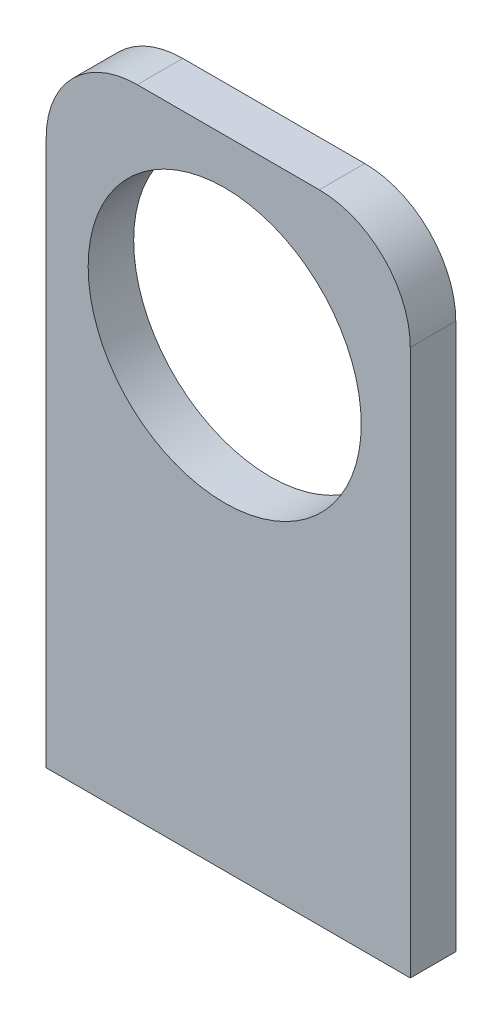
ISO-10303-21;
HEADER;
FILE_DESCRIPTION(('STEP AP214'),'2;1');
FILE_NAME('part.step','',(''),(''),'','','');
FILE_SCHEMA(('AUTOMOTIVE_DESIGN { 1 0 10303 214 1 1 1 1 }'));
ENDSEC;
DATA;
#1=APPLICATION_CONTEXT('core data for automotive mechanical design processes');
#2=APPLICATION_PROTOCOL_DEFINITION('international standard','automotive_design',2000,#1);
#3=PRODUCT_CONTEXT('',#1,'mechanical');
#4=PRODUCT('Part','Part','',(#3));
#5=PRODUCT_RELATED_PRODUCT_CATEGORY('part','',(#4));
#6=PRODUCT_DEFINITION_FORMATION('','',#4);
#7=PRODUCT_DEFINITION_CONTEXT('part definition',#1,'design');
#8=PRODUCT_DEFINITION('design','',#6,#7);
#9=PRODUCT_DEFINITION_SHAPE('','',#8);
#10=(LENGTH_UNIT() NAMED_UNIT(*) SI_UNIT(.MILLI.,.METRE.));
#11=(NAMED_UNIT(*) PLANE_ANGLE_UNIT() SI_UNIT($,.RADIAN.));
#12=(NAMED_UNIT(*) SI_UNIT($,.STERADIAN.) SOLID_ANGLE_UNIT());
#13=UNCERTAINTY_MEASURE_WITH_UNIT(LENGTH_MEASURE(1.E-05),#10,'distance_accuracy_value','');
#14=(GEOMETRIC_REPRESENTATION_CONTEXT(3) GLOBAL_UNCERTAINTY_ASSIGNED_CONTEXT((#13)) GLOBAL_UNIT_ASSIGNED_CONTEXT((#10,
#11,#12)) REPRESENTATION_CONTEXT('',''));
#15=CARTESIAN_POINT('',(0.,0.,0.));
#16=DIRECTION('',(0.,0.,1.));
#17=DIRECTION('',(1.,0.,0.));
#18=AXIS2_PLACEMENT_3D('',#15,#16,#17);
#19=CARTESIAN_POINT('',(0.,0.,3.175));
#20=DIRECTION('',(0.,0.,-1.));
#21=DIRECTION('',(-1.,0.,0.));
#22=AXIS2_PLACEMENT_3D('',#19,#20,#21);
#23=PLANE('',#22);
#24=DIRECTION('',(-1.,0.,0.));
#25=VECTOR('',#24,1.);
#26=CARTESIAN_POINT('',(-0.417525773195876,1.06958762886598,3.175));
#27=LINE('',#26,#25);
#28=CARTESIAN_POINT('',(18.6324742268041,1.06958762886598,3.175));
#29=VERTEX_POINT('',#28);
#30=CARTESIAN_POINT('',(5.93247422680412,1.06958762886598,3.175));
#31=VERTEX_POINT('',#30);
#32=EDGE_CURVE('E114',#29,#31,#27,.T.);
#33=ORIENTED_EDGE('',*,*,#32,.T.);
#34=CARTESIAN_POINT('',(5.93247422680412,-5.28041237113402,3.175));
#35=DIRECTION('',(0.,0.,-1.));
#36=DIRECTION('',(-1.,0.,0.));
#37=AXIS2_PLACEMENT_3D('',#34,#35,#36);
#38=CIRCLE('',#37,6.35);
#39=CARTESIAN_POINT('',(-0.417525773195876,-5.28041237113402,3.175));
#40=VERTEX_POINT('',#39);
#41=EDGE_CURVE('E40',#31,#40,#38,.F.);
#42=ORIENTED_EDGE('',*,*,#41,.T.);
#43=DIRECTION('',(0.,-1.,0.));
#44=VECTOR('',#43,1.);
#45=CARTESIAN_POINT('',(-0.417525773195877,-43.380412371134,3.175));
#46=LINE('',#45,#44);
#47=CARTESIAN_POINT('',(-0.417525773195877,-43.380412371134,3.175));
#48=VERTEX_POINT('',#47);
#49=EDGE_CURVE('E86',#40,#48,#46,.T.);
#50=ORIENTED_EDGE('',*,*,#49,.T.);
#51=DIRECTION('',(1.,0.,0.));
#52=VECTOR('',#51,1.);
#53=CARTESIAN_POINT('',(-0.417525773195877,-43.380412371134,3.175));
#54=LINE('',#53,#52);
#55=CARTESIAN_POINT('',(24.9824742268041,-43.380412371134,3.175));
#56=VERTEX_POINT('',#55);
#57=EDGE_CURVE('E89',#48,#56,#54,.T.);
#58=ORIENTED_EDGE('',*,*,#57,.T.);
#59=DIRECTION('',(0.,1.,0.));
#60=VECTOR('',#59,1.);
#61=CARTESIAN_POINT('',(24.9824742268041,-43.380412371134,3.175));
#62=LINE('',#61,#60);
#63=CARTESIAN_POINT('',(24.9824742268041,-5.28041237113402,3.175));
#64=VERTEX_POINT('',#63);
#65=EDGE_CURVE('E104',#56,#64,#62,.T.);
#66=ORIENTED_EDGE('',*,*,#65,.T.);
#67=CARTESIAN_POINT('',(18.6324742268041,-5.28041237113402,3.175));
#68=DIRECTION('',(0.,0.,-1.));
#69=DIRECTION('',(-1.,0.,0.));
#70=AXIS2_PLACEMENT_3D('',#67,#68,#69);
#71=CIRCLE('',#70,6.35);
#72=EDGE_CURVE('E125',#64,#29,#71,.F.);
#73=ORIENTED_EDGE('',*,*,#72,.T.);
#74=EDGE_LOOP('',(#33,#42,#50,#58,#66,#73));
#75=FACE_BOUND('',#74,.T.);
#76=CARTESIAN_POINT('',(12.0350162678135,-11.630412371134,3.175));
#77=DIRECTION('',(0.,0.,1.));
#78=DIRECTION('',(1.,0.,0.));
#79=AXIS2_PLACEMENT_3D('',#76,#77,#78);
#80=CIRCLE('',#79,9.525);
#81=CARTESIAN_POINT('',(21.5600162678135,-11.630412371134,3.175));
#82=VERTEX_POINT('',#81);
#83=EDGE_CURVE('E142',#82,#82,#80,.T.);
#84=ORIENTED_EDGE('',*,*,#83,.F.);
#85=EDGE_LOOP('',(#84));
#86=FACE_BOUND('',#85,.T.);
#87=ADVANCED_FACE('F32',(#75,#86),#23,.F.);
#88=CARTESIAN_POINT('',(0.,0.,0.));
#89=DIRECTION('',(0.,0.,-1.));
#90=DIRECTION('',(-1.,0.,0.));
#91=AXIS2_PLACEMENT_3D('',#88,#89,#90);
#92=PLANE('',#91);
#93=DIRECTION('',(0.,-1.,0.));
#94=VECTOR('',#93,1.);
#95=CARTESIAN_POINT('',(-0.417525773195877,-43.380412371134,0.));
#96=LINE('',#95,#94);
#97=CARTESIAN_POINT('',(-0.417525773195876,-5.28041237113402,0.));
#98=VERTEX_POINT('',#97);
#99=CARTESIAN_POINT('',(-0.417525773195877,-43.380412371134,0.));
#100=VERTEX_POINT('',#99);
#101=EDGE_CURVE('E108',#98,#100,#96,.T.);
#102=ORIENTED_EDGE('',*,*,#101,.F.);
#103=CARTESIAN_POINT('',(5.93247422680412,-5.28041237113402,0.));
#104=DIRECTION('',(0.,0.,-1.));
#105=DIRECTION('',(-1.,0.,0.));
#106=AXIS2_PLACEMENT_3D('',#103,#104,#105);
#107=CIRCLE('',#106,6.35);
#108=CARTESIAN_POINT('',(5.93247422680412,1.06958762886598,0.));
#109=VERTEX_POINT('',#108);
#110=EDGE_CURVE('E119',#98,#109,#107,.T.);
#111=ORIENTED_EDGE('',*,*,#110,.T.);
#112=DIRECTION('',(-1.,0.,0.));
#113=VECTOR('',#112,1.);
#114=CARTESIAN_POINT('',(-0.417525773195876,1.06958762886598,0.));
#115=LINE('',#114,#113);
#116=CARTESIAN_POINT('',(18.6324742268041,1.06958762886598,0.));
#117=VERTEX_POINT('',#116);
#118=EDGE_CURVE('E96',#117,#109,#115,.T.);
#119=ORIENTED_EDGE('',*,*,#118,.F.);
#120=CARTESIAN_POINT('',(18.6324742268041,-5.28041237113402,0.));
#121=DIRECTION('',(0.,0.,-1.));
#122=DIRECTION('',(-1.,0.,0.));
#123=AXIS2_PLACEMENT_3D('',#120,#121,#122);
#124=CIRCLE('',#123,6.35);
#125=CARTESIAN_POINT('',(24.9824742268041,-5.28041237113402,0.));
#126=VERTEX_POINT('',#125);
#127=EDGE_CURVE('E112',#117,#126,#124,.T.);
#128=ORIENTED_EDGE('',*,*,#127,.T.);
#129=DIRECTION('',(0.,1.,0.));
#130=VECTOR('',#129,1.);
#131=CARTESIAN_POINT('',(24.9824742268041,-43.380412371134,0.));
#132=LINE('',#131,#130);
#133=CARTESIAN_POINT('',(24.9824742268041,-43.380412371134,0.));
#134=VERTEX_POINT('',#133);
#135=EDGE_CURVE('E136',#134,#126,#132,.T.);
#136=ORIENTED_EDGE('',*,*,#135,.F.);
#137=DIRECTION('',(1.,0.,0.));
#138=VECTOR('',#137,1.);
#139=CARTESIAN_POINT('',(-0.417525773195877,-43.380412371134,0.));
#140=LINE('',#139,#138);
#141=EDGE_CURVE('E138',#100,#134,#140,.T.);
#142=ORIENTED_EDGE('',*,*,#141,.F.);
#143=EDGE_LOOP('',(#102,#111,#119,#128,#136,#142));
#144=FACE_BOUND('',#143,.T.);
#145=CARTESIAN_POINT('',(12.0350162678135,-11.630412371134,0.));
#146=DIRECTION('',(0.,0.,1.));
#147=DIRECTION('',(1.,0.,0.));
#148=AXIS2_PLACEMENT_3D('',#145,#146,#147);
#149=CIRCLE('',#148,9.525);
#150=CARTESIAN_POINT('',(21.5600162678135,-11.630412371134,0.));
#151=VERTEX_POINT('',#150);
#152=EDGE_CURVE('E145',#151,#151,#149,.T.);
#153=ORIENTED_EDGE('',*,*,#152,.T.);
#154=EDGE_LOOP('',(#153));
#155=FACE_BOUND('',#154,.T.);
#156=ADVANCED_FACE('F134',(#144,#155),#92,.T.);
#157=CARTESIAN_POINT('',(-0.417525773195877,-43.380412371134,3.175));
#158=DIRECTION('',(1.,0.,0.));
#159=DIRECTION('',(0.,1.,0.));
#160=AXIS2_PLACEMENT_3D('',#157,#158,#159);
#161=PLANE('',#160);
#162=ORIENTED_EDGE('',*,*,#49,.F.);
#163=DIRECTION('',(0.,0.,-1.));
#164=VECTOR('',#163,1.);
#165=CARTESIAN_POINT('',(-0.417525773195876,-5.28041237113402,3.175));
#166=LINE('',#165,#164);
#167=EDGE_CURVE('E110',#40,#98,#166,.T.);
#168=ORIENTED_EDGE('',*,*,#167,.T.);
#169=ORIENTED_EDGE('',*,*,#101,.T.);
#170=DIRECTION('',(0.,0.,-1.));
#171=VECTOR('',#170,1.);
#172=CARTESIAN_POINT('',(-0.417525773195877,-43.380412371134,3.175));
#173=LINE('',#172,#171);
#174=EDGE_CURVE('E101',#48,#100,#173,.T.);
#175=ORIENTED_EDGE('',*,*,#174,.F.);
#176=EDGE_LOOP('',(#162,#168,#169,#175));
#177=FACE_BOUND('',#176,.T.);
#178=ADVANCED_FACE('F106',(#177),#161,.F.);
#179=CARTESIAN_POINT('',(-0.417525773195877,-43.380412371134,3.175));
#180=DIRECTION('',(0.,1.,0.));
#181=DIRECTION('',(0.,0.,1.));
#182=AXIS2_PLACEMENT_3D('',#179,#180,#181);
#183=PLANE('',#182);
#184=ORIENTED_EDGE('',*,*,#141,.T.);
#185=DIRECTION('',(0.,0.,-1.));
#186=VECTOR('',#185,1.);
#187=CARTESIAN_POINT('',(24.9824742268041,-43.380412371134,3.175));
#188=LINE('',#187,#186);
#189=EDGE_CURVE('E103',#56,#134,#188,.T.);
#190=ORIENTED_EDGE('',*,*,#189,.F.);
#191=ORIENTED_EDGE('',*,*,#57,.F.);
#192=ORIENTED_EDGE('',*,*,#174,.T.);
#193=EDGE_LOOP('',(#184,#190,#191,#192));
#194=FACE_BOUND('',#193,.T.);
#195=ADVANCED_FACE('F100',(#194),#183,.F.);
#196=CARTESIAN_POINT('',(24.9824742268041,-43.380412371134,3.175));
#197=DIRECTION('',(-1.,0.,0.));
#198=DIRECTION('',(0.,0.,1.));
#199=AXIS2_PLACEMENT_3D('',#196,#197,#198);
#200=PLANE('',#199);
#201=ORIENTED_EDGE('',*,*,#135,.T.);
#202=DIRECTION('',(0.,0.,-1.));
#203=VECTOR('',#202,1.);
#204=CARTESIAN_POINT('',(24.9824742268041,-5.28041237113402,3.175));
#205=LINE('',#204,#203);
#206=EDGE_CURVE('E11',#126,#64,#205,.F.);
#207=ORIENTED_EDGE('',*,*,#206,.T.);
#208=ORIENTED_EDGE('',*,*,#65,.F.);
#209=ORIENTED_EDGE('',*,*,#189,.T.);
#210=EDGE_LOOP('',(#201,#207,#208,#209));
#211=FACE_BOUND('',#210,.T.);
#212=ADVANCED_FACE('F137',(#211),#200,.F.);
#213=CARTESIAN_POINT('',(-0.417525773195876,1.06958762886598,3.175));
#214=DIRECTION('',(0.,-1.,0.));
#215=DIRECTION('',(0.,0.,-1.));
#216=AXIS2_PLACEMENT_3D('',#213,#214,#215);
#217=PLANE('',#216);
#218=ORIENTED_EDGE('',*,*,#118,.T.);
#219=DIRECTION('',(0.,0.,-1.));
#220=VECTOR('',#219,1.);
#221=CARTESIAN_POINT('',(5.93247422680412,1.06958762886598,3.175));
#222=LINE('',#221,#220);
#223=EDGE_CURVE('E53',#109,#31,#222,.F.);
#224=ORIENTED_EDGE('',*,*,#223,.T.);
#225=ORIENTED_EDGE('',*,*,#32,.F.);
#226=DIRECTION('',(0.,0.,-1.));
#227=VECTOR('',#226,1.);
#228=CARTESIAN_POINT('',(18.6324742268041,1.06958762886598,3.175));
#229=LINE('',#228,#227);
#230=EDGE_CURVE('E121',#29,#117,#229,.T.);
#231=ORIENTED_EDGE('',*,*,#230,.T.);
#232=EDGE_LOOP('',(#218,#224,#225,#231));
#233=FACE_BOUND('',#232,.T.);
#234=ADVANCED_FACE('F129',(#233),#217,.F.);
#235=CARTESIAN_POINT('',(12.0350162678135,-11.630412371134,3.175));
#236=DIRECTION('',(0.,0.,-1.));
#237=DIRECTION('',(-1.,0.,0.));
#238=AXIS2_PLACEMENT_3D('',#235,#236,#237);
#239=CYLINDRICAL_SURFACE('',#238,9.525);
#240=ORIENTED_EDGE('',*,*,#83,.T.);
#241=EDGE_LOOP('',(#240));
#242=FACE_BOUND('',#241,.T.);
#243=ORIENTED_EDGE('',*,*,#152,.F.);
#244=EDGE_LOOP('',(#243));
#245=FACE_BOUND('',#244,.T.);
#246=ADVANCED_FACE('F151',(#242,#245),#239,.F.);
#247=CARTESIAN_POINT('',(5.93247422680412,-5.28041237113402,3.175));
#248=DIRECTION('',(0.,0.,-1.));
#249=DIRECTION('',(-1.,0.,0.));
#250=AXIS2_PLACEMENT_3D('',#247,#248,#249);
#251=CYLINDRICAL_SURFACE('',#250,6.35);
#252=ORIENTED_EDGE('',*,*,#41,.F.);
#253=ORIENTED_EDGE('',*,*,#223,.F.);
#254=ORIENTED_EDGE('',*,*,#110,.F.);
#255=ORIENTED_EDGE('',*,*,#167,.F.);
#256=EDGE_LOOP('',(#252,#253,#254,#255));
#257=FACE_BOUND('',#256,.T.);
#258=ADVANCED_FACE('F168',(#257),#251,.T.);
#259=CARTESIAN_POINT('',(18.6324742268041,-5.28041237113402,3.175));
#260=DIRECTION('',(0.,0.,-1.));
#261=DIRECTION('',(-1.,0.,0.));
#262=AXIS2_PLACEMENT_3D('',#259,#260,#261);
#263=CYLINDRICAL_SURFACE('',#262,6.35);
#264=ORIENTED_EDGE('',*,*,#72,.F.);
#265=ORIENTED_EDGE('',*,*,#206,.F.);
#266=ORIENTED_EDGE('',*,*,#127,.F.);
#267=ORIENTED_EDGE('',*,*,#230,.F.);
#268=EDGE_LOOP('',(#264,#265,#266,#267));
#269=FACE_BOUND('',#268,.T.);
#270=ADVANCED_FACE('F34',(#269),#263,.T.);
#271=CLOSED_SHELL('',(#87,#156,#178,#195,#212,#234,#246,#258,#270));
#272=MANIFOLD_SOLID_BREP('B2',#271);
#273=ADVANCED_BREP_SHAPE_REPRESENTATION('',(#18,#272),#14);
#274=SHAPE_DEFINITION_REPRESENTATION(#9,#273);
ENDSEC;
END-ISO-10303-21;
